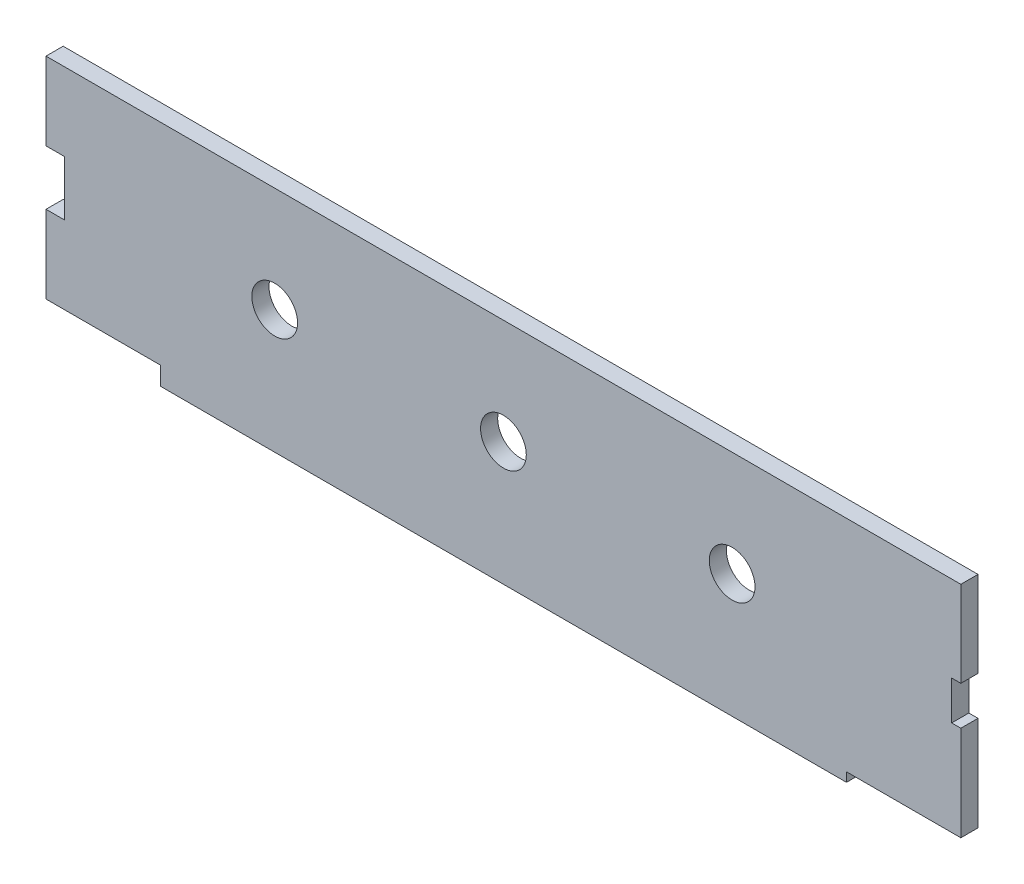
ISO-10303-21;
HEADER;
FILE_DESCRIPTION(('STEP AP214'),'2;1');
FILE_NAME('part.step','',(''),(''),'','','');
FILE_SCHEMA(('AUTOMOTIVE_DESIGN { 1 0 10303 214 1 1 1 1 }'));
ENDSEC;
DATA;
#1=APPLICATION_CONTEXT('core data for automotive mechanical design processes');
#2=APPLICATION_PROTOCOL_DEFINITION('international standard','automotive_design',2000,#1);
#3=PRODUCT_CONTEXT('',#1,'mechanical');
#4=PRODUCT('Part','Part','',(#3));
#5=PRODUCT_RELATED_PRODUCT_CATEGORY('part','',(#4));
#6=PRODUCT_DEFINITION_FORMATION('','',#4);
#7=PRODUCT_DEFINITION_CONTEXT('part definition',#1,'design');
#8=PRODUCT_DEFINITION('design','',#6,#7);
#9=PRODUCT_DEFINITION_SHAPE('','',#8);
#10=(LENGTH_UNIT() NAMED_UNIT(*) SI_UNIT(.MILLI.,.METRE.));
#11=(NAMED_UNIT(*) PLANE_ANGLE_UNIT() SI_UNIT($,.RADIAN.));
#12=(NAMED_UNIT(*) SI_UNIT($,.STERADIAN.) SOLID_ANGLE_UNIT());
#13=UNCERTAINTY_MEASURE_WITH_UNIT(LENGTH_MEASURE(1.E-05),#10,'distance_accuracy_value','');
#14=(GEOMETRIC_REPRESENTATION_CONTEXT(3) GLOBAL_UNCERTAINTY_ASSIGNED_CONTEXT((#13)) GLOBAL_UNIT_ASSIGNED_CONTEXT((#10,
#11,#12)) REPRESENTATION_CONTEXT('',''));
#15=CARTESIAN_POINT('',(0.,0.,0.));
#16=DIRECTION('',(0.,0.,1.));
#17=DIRECTION('',(1.,0.,0.));
#18=AXIS2_PLACEMENT_3D('',#15,#16,#17);
#19=CARTESIAN_POINT('',(0.,0.,1.5));
#20=DIRECTION('',(0.,0.,-1.));
#21=DIRECTION('',(-1.,0.,0.));
#22=AXIS2_PLACEMENT_3D('',#19,#20,#21);
#23=PLANE('',#22);
#24=DIRECTION('',(0.,-1.,0.));
#25=VECTOR('',#24,1.);
#26=CARTESIAN_POINT('',(-40.,2.4,1.5));
#27=LINE('',#26,#25);
#28=CARTESIAN_POINT('',(-40.,9.19999999999997,1.5));
#29=VERTEX_POINT('',#28);
#30=CARTESIAN_POINT('',(-40.,2.4,1.5));
#31=VERTEX_POINT('',#30);
#32=EDGE_CURVE('E209',#29,#31,#27,.T.);
#33=ORIENTED_EDGE('',*,*,#32,.T.);
#34=DIRECTION('',(1.,0.,0.));
#35=VECTOR('',#34,1.);
#36=CARTESIAN_POINT('',(-38.4,2.4,1.5));
#37=LINE('',#36,#35);
#38=CARTESIAN_POINT('',(-38.4,2.4,1.5));
#39=VERTEX_POINT('',#38);
#40=EDGE_CURVE('E117',#31,#39,#37,.T.);
#41=ORIENTED_EDGE('',*,*,#40,.T.);
#42=DIRECTION('',(0.,-1.,0.));
#43=VECTOR('',#42,1.);
#44=CARTESIAN_POINT('',(-38.4,-2.4,1.5));
#45=LINE('',#44,#43);
#46=CARTESIAN_POINT('',(-38.4,-2.4,1.5));
#47=VERTEX_POINT('',#46);
#48=EDGE_CURVE('E248',#39,#47,#45,.T.);
#49=ORIENTED_EDGE('',*,*,#48,.T.);
#50=DIRECTION('',(-1.,0.,0.));
#51=VECTOR('',#50,1.);
#52=CARTESIAN_POINT('',(-40.,-2.4,1.5));
#53=LINE('',#52,#51);
#54=CARTESIAN_POINT('',(-40.,-2.4,1.5));
#55=VERTEX_POINT('',#54);
#56=EDGE_CURVE('E267',#47,#55,#53,.T.);
#57=ORIENTED_EDGE('',*,*,#56,.T.);
#58=DIRECTION('',(0.,-1.,0.));
#59=VECTOR('',#58,1.);
#60=CARTESIAN_POINT('',(-40.,-9.20000000000003,1.5));
#61=LINE('',#60,#59);
#62=CARTESIAN_POINT('',(-40.,-9.20000000000003,1.5));
#63=VERTEX_POINT('',#62);
#64=EDGE_CURVE('E264',#55,#63,#61,.T.);
#65=ORIENTED_EDGE('',*,*,#64,.T.);
#66=DIRECTION('',(1.,0.,0.));
#67=VECTOR('',#66,1.);
#68=CARTESIAN_POINT('',(-30.,-9.2,1.5));
#69=LINE('',#68,#67);
#70=CARTESIAN_POINT('',(-30.,-9.2,1.5));
#71=VERTEX_POINT('',#70);
#72=EDGE_CURVE('E266',#63,#71,#69,.T.);
#73=ORIENTED_EDGE('',*,*,#72,.T.);
#74=DIRECTION('',(0.,-1.,0.));
#75=VECTOR('',#74,1.);
#76=CARTESIAN_POINT('',(-30.,-10.8,1.5));
#77=LINE('',#76,#75);
#78=CARTESIAN_POINT('',(-30.,-10.8,1.5));
#79=VERTEX_POINT('',#78);
#80=EDGE_CURVE('E269',#71,#79,#77,.T.);
#81=ORIENTED_EDGE('',*,*,#80,.T.);
#82=DIRECTION('',(1.,0.,0.));
#83=VECTOR('',#82,1.);
#84=CARTESIAN_POINT('',(30.,-10.7999999999999,1.5));
#85=LINE('',#84,#83);
#86=CARTESIAN_POINT('',(30.,-10.7999999999999,1.5));
#87=VERTEX_POINT('',#86);
#88=EDGE_CURVE('E275',#79,#87,#85,.T.);
#89=ORIENTED_EDGE('',*,*,#88,.T.);
#90=DIRECTION('',(0.,1.,0.));
#91=VECTOR('',#90,1.);
#92=CARTESIAN_POINT('',(30.,-9.99999999999986,1.5));
#93=LINE('',#92,#91);
#94=CARTESIAN_POINT('',(30.,-9.99999999999986,1.5));
#95=VERTEX_POINT('',#94);
#96=EDGE_CURVE('E277',#87,#95,#93,.T.);
#97=ORIENTED_EDGE('',*,*,#96,.T.);
#98=DIRECTION('',(1.,0.,0.));
#99=VECTOR('',#98,1.);
#100=CARTESIAN_POINT('',(40.,-9.99999999999984,1.5));
#101=LINE('',#100,#99);
#102=CARTESIAN_POINT('',(40.,-9.99999999999984,1.5));
#103=VERTEX_POINT('',#102);
#104=EDGE_CURVE('E279',#95,#103,#101,.T.);
#105=ORIENTED_EDGE('',*,*,#104,.T.);
#106=DIRECTION('',(0.,1.,0.));
#107=VECTOR('',#106,1.);
#108=CARTESIAN_POINT('',(40.,-1.7,1.5));
#109=LINE('',#108,#107);
#110=CARTESIAN_POINT('',(40.,-1.7,1.5));
#111=VERTEX_POINT('',#110);
#112=EDGE_CURVE('E281',#103,#111,#109,.T.);
#113=ORIENTED_EDGE('',*,*,#112,.T.);
#114=DIRECTION('',(-1.,0.,0.));
#115=VECTOR('',#114,1.);
#116=CARTESIAN_POINT('',(39.2,-1.7,1.5));
#117=LINE('',#116,#115);
#118=CARTESIAN_POINT('',(39.2,-1.7,1.5));
#119=VERTEX_POINT('',#118);
#120=EDGE_CURVE('E283',#111,#119,#117,.T.);
#121=ORIENTED_EDGE('',*,*,#120,.T.);
#122=DIRECTION('',(0.,1.,0.));
#123=VECTOR('',#122,1.);
#124=CARTESIAN_POINT('',(39.2,1.7,1.5));
#125=LINE('',#124,#123);
#126=CARTESIAN_POINT('',(39.2,1.7,1.5));
#127=VERTEX_POINT('',#126);
#128=EDGE_CURVE('E160',#119,#127,#125,.T.);
#129=ORIENTED_EDGE('',*,*,#128,.T.);
#130=DIRECTION('',(1.,0.,0.));
#131=VECTOR('',#130,1.);
#132=CARTESIAN_POINT('',(40.,1.7,1.5));
#133=LINE('',#132,#131);
#134=CARTESIAN_POINT('',(40.,1.7,1.5));
#135=VERTEX_POINT('',#134);
#136=EDGE_CURVE('E154',#127,#135,#133,.T.);
#137=ORIENTED_EDGE('',*,*,#136,.T.);
#138=DIRECTION('',(0.,1.,0.));
#139=VECTOR('',#138,1.);
#140=CARTESIAN_POINT('',(40.,9.19999999999999,1.5));
#141=LINE('',#140,#139);
#142=CARTESIAN_POINT('',(40.,9.19999999999999,1.5));
#143=VERTEX_POINT('',#142);
#144=EDGE_CURVE('E158',#135,#143,#141,.T.);
#145=ORIENTED_EDGE('',*,*,#144,.T.);
#146=DIRECTION('',(-1.,0.,0.));
#147=VECTOR('',#146,1.);
#148=CARTESIAN_POINT('',(-40.,9.19999999999997,1.5));
#149=LINE('',#148,#147);
#150=EDGE_CURVE('E50',#143,#29,#149,.T.);
#151=ORIENTED_EDGE('',*,*,#150,.T.);
#152=EDGE_LOOP('',(#33,#41,#49,#57,#65,#73,#81,#89,#97,#105,#113,#121,#129,#137,#145,#151));
#153=FACE_BOUND('',#152,.T.);
#154=CARTESIAN_POINT('',(20.,0.,1.5));
#155=DIRECTION('',(0.,0.,1.));
#156=DIRECTION('',(1.,0.,0.));
#157=AXIS2_PLACEMENT_3D('',#154,#155,#156);
#158=CIRCLE('',#157,2.00000000000002);
#159=CARTESIAN_POINT('',(22.,0.,1.5));
#160=VERTEX_POINT('',#159);
#161=EDGE_CURVE('E182',#160,#160,#158,.T.);
#162=ORIENTED_EDGE('',*,*,#161,.F.);
#163=EDGE_LOOP('',(#162));
#164=FACE_BOUND('',#163,.T.);
#165=CARTESIAN_POINT('',(0.,0.,1.5));
#166=DIRECTION('',(0.,0.,1.));
#167=DIRECTION('',(1.,0.,0.));
#168=AXIS2_PLACEMENT_3D('',#165,#166,#167);
#169=CIRCLE('',#168,2.00000000000002);
#170=CARTESIAN_POINT('',(2.,0.,1.5));
#171=VERTEX_POINT('',#170);
#172=EDGE_CURVE('E337',#171,#171,#169,.T.);
#173=ORIENTED_EDGE('',*,*,#172,.F.);
#174=EDGE_LOOP('',(#173));
#175=FACE_BOUND('',#174,.T.);
#176=CARTESIAN_POINT('',(-20.,0.,1.5));
#177=DIRECTION('',(0.,0.,1.));
#178=DIRECTION('',(1.,0.,0.));
#179=AXIS2_PLACEMENT_3D('',#176,#177,#178);
#180=CIRCLE('',#179,2.00000000000002);
#181=CARTESIAN_POINT('',(-18.,0.,1.5));
#182=VERTEX_POINT('',#181);
#183=EDGE_CURVE('E328',#182,#182,#180,.T.);
#184=ORIENTED_EDGE('',*,*,#183,.F.);
#185=EDGE_LOOP('',(#184));
#186=FACE_BOUND('',#185,.T.);
#187=ADVANCED_FACE('F33',(#153,#164,#175,#186),#23,.F.);
#188=CARTESIAN_POINT('',(0.,0.,0.));
#189=DIRECTION('',(0.,0.,-1.));
#190=DIRECTION('',(-1.,0.,0.));
#191=AXIS2_PLACEMENT_3D('',#188,#189,#190);
#192=PLANE('',#191);
#193=CARTESIAN_POINT('',(0.,0.,0.));
#194=DIRECTION('',(0.,0.,1.));
#195=DIRECTION('',(1.,0.,0.));
#196=AXIS2_PLACEMENT_3D('',#193,#194,#195);
#197=CIRCLE('',#196,2.00000000000002);
#198=CARTESIAN_POINT('',(2.,0.,0.));
#199=VERTEX_POINT('',#198);
#200=EDGE_CURVE('E334',#199,#199,#197,.T.);
#201=ORIENTED_EDGE('',*,*,#200,.T.);
#202=EDGE_LOOP('',(#201));
#203=FACE_BOUND('',#202,.T.);
#204=DIRECTION('',(0.,-1.,0.));
#205=VECTOR('',#204,1.);
#206=CARTESIAN_POINT('',(-40.,2.4,0.));
#207=LINE('',#206,#205);
#208=CARTESIAN_POINT('',(-40.,9.19999999999997,0.));
#209=VERTEX_POINT('',#208);
#210=CARTESIAN_POINT('',(-40.,2.4,0.));
#211=VERTEX_POINT('',#210);
#212=EDGE_CURVE('E178',#209,#211,#207,.T.);
#213=ORIENTED_EDGE('',*,*,#212,.F.);
#214=DIRECTION('',(-1.,0.,0.));
#215=VECTOR('',#214,1.);
#216=CARTESIAN_POINT('',(-40.,9.19999999999997,0.));
#217=LINE('',#216,#215);
#218=CARTESIAN_POINT('',(40.,9.19999999999999,0.));
#219=VERTEX_POINT('',#218);
#220=EDGE_CURVE('E109',#219,#209,#217,.T.);
#221=ORIENTED_EDGE('',*,*,#220,.F.);
#222=DIRECTION('',(0.,1.,0.));
#223=VECTOR('',#222,1.);
#224=CARTESIAN_POINT('',(40.,9.19999999999999,0.));
#225=LINE('',#224,#223);
#226=CARTESIAN_POINT('',(40.,1.7,0.));
#227=VERTEX_POINT('',#226);
#228=EDGE_CURVE('E103',#227,#219,#225,.T.);
#229=ORIENTED_EDGE('',*,*,#228,.F.);
#230=DIRECTION('',(1.,0.,0.));
#231=VECTOR('',#230,1.);
#232=CARTESIAN_POINT('',(40.,1.7,0.));
#233=LINE('',#232,#231);
#234=CARTESIAN_POINT('',(39.2,1.7,0.));
#235=VERTEX_POINT('',#234);
#236=EDGE_CURVE('E168',#235,#227,#233,.T.);
#237=ORIENTED_EDGE('',*,*,#236,.F.);
#238=DIRECTION('',(0.,1.,0.));
#239=VECTOR('',#238,1.);
#240=CARTESIAN_POINT('',(39.2,1.7,0.));
#241=LINE('',#240,#239);
#242=CARTESIAN_POINT('',(39.2,-1.7,0.));
#243=VERTEX_POINT('',#242);
#244=EDGE_CURVE('E204',#243,#235,#241,.T.);
#245=ORIENTED_EDGE('',*,*,#244,.F.);
#246=DIRECTION('',(-1.,0.,0.));
#247=VECTOR('',#246,1.);
#248=CARTESIAN_POINT('',(39.2,-1.7,0.));
#249=LINE('',#248,#247);
#250=CARTESIAN_POINT('',(40.,-1.7,0.));
#251=VERTEX_POINT('',#250);
#252=EDGE_CURVE('E202',#251,#243,#249,.T.);
#253=ORIENTED_EDGE('',*,*,#252,.F.);
#254=DIRECTION('',(0.,1.,0.));
#255=VECTOR('',#254,1.);
#256=CARTESIAN_POINT('',(40.,-1.7,0.));
#257=LINE('',#256,#255);
#258=CARTESIAN_POINT('',(40.,-9.99999999999984,0.));
#259=VERTEX_POINT('',#258);
#260=EDGE_CURVE('E200',#259,#251,#257,.T.);
#261=ORIENTED_EDGE('',*,*,#260,.F.);
#262=DIRECTION('',(1.,0.,0.));
#263=VECTOR('',#262,1.);
#264=CARTESIAN_POINT('',(40.,-9.99999999999984,0.));
#265=LINE('',#264,#263);
#266=CARTESIAN_POINT('',(30.,-9.99999999999986,0.));
#267=VERTEX_POINT('',#266);
#268=EDGE_CURVE('E198',#267,#259,#265,.T.);
#269=ORIENTED_EDGE('',*,*,#268,.F.);
#270=DIRECTION('',(0.,1.,0.));
#271=VECTOR('',#270,1.);
#272=CARTESIAN_POINT('',(30.,-9.99999999999986,0.));
#273=LINE('',#272,#271);
#274=CARTESIAN_POINT('',(30.,-10.7999999999999,0.));
#275=VERTEX_POINT('',#274);
#276=EDGE_CURVE('E196',#275,#267,#273,.T.);
#277=ORIENTED_EDGE('',*,*,#276,.F.);
#278=DIRECTION('',(1.,0.,0.));
#279=VECTOR('',#278,1.);
#280=CARTESIAN_POINT('',(30.,-10.7999999999999,0.));
#281=LINE('',#280,#279);
#282=CARTESIAN_POINT('',(-30.,-10.8,0.));
#283=VERTEX_POINT('',#282);
#284=EDGE_CURVE('E194',#283,#275,#281,.T.);
#285=ORIENTED_EDGE('',*,*,#284,.F.);
#286=DIRECTION('',(0.,-1.,0.));
#287=VECTOR('',#286,1.);
#288=CARTESIAN_POINT('',(-30.,-10.8,0.));
#289=LINE('',#288,#287);
#290=CARTESIAN_POINT('',(-30.,-9.2,0.));
#291=VERTEX_POINT('',#290);
#292=EDGE_CURVE('E192',#291,#283,#289,.T.);
#293=ORIENTED_EDGE('',*,*,#292,.F.);
#294=DIRECTION('',(1.,0.,0.));
#295=VECTOR('',#294,1.);
#296=CARTESIAN_POINT('',(-30.,-9.2,0.));
#297=LINE('',#296,#295);
#298=CARTESIAN_POINT('',(-40.,-9.20000000000003,0.));
#299=VERTEX_POINT('',#298);
#300=EDGE_CURVE('E190',#299,#291,#297,.T.);
#301=ORIENTED_EDGE('',*,*,#300,.F.);
#302=DIRECTION('',(0.,-1.,0.));
#303=VECTOR('',#302,1.);
#304=CARTESIAN_POINT('',(-40.,-9.20000000000003,0.));
#305=LINE('',#304,#303);
#306=CARTESIAN_POINT('',(-40.,-2.4,0.));
#307=VERTEX_POINT('',#306);
#308=EDGE_CURVE('E188',#307,#299,#305,.T.);
#309=ORIENTED_EDGE('',*,*,#308,.F.);
#310=DIRECTION('',(-1.,0.,0.));
#311=VECTOR('',#310,1.);
#312=CARTESIAN_POINT('',(-40.,-2.4,0.));
#313=LINE('',#312,#311);
#314=CARTESIAN_POINT('',(-38.4,-2.4,0.));
#315=VERTEX_POINT('',#314);
#316=EDGE_CURVE('E186',#315,#307,#313,.T.);
#317=ORIENTED_EDGE('',*,*,#316,.F.);
#318=DIRECTION('',(0.,-1.,0.));
#319=VECTOR('',#318,1.);
#320=CARTESIAN_POINT('',(-38.4,-2.4,0.));
#321=LINE('',#320,#319);
#322=CARTESIAN_POINT('',(-38.4,2.4,0.));
#323=VERTEX_POINT('',#322);
#324=EDGE_CURVE('E184',#323,#315,#321,.T.);
#325=ORIENTED_EDGE('',*,*,#324,.F.);
#326=DIRECTION('',(1.,0.,0.));
#327=VECTOR('',#326,1.);
#328=CARTESIAN_POINT('',(-38.4,2.4,0.));
#329=LINE('',#328,#327);
#330=EDGE_CURVE('E181',#211,#323,#329,.T.);
#331=ORIENTED_EDGE('',*,*,#330,.F.);
#332=EDGE_LOOP('',(#213,#221,#229,#237,#245,#253,#261,#269,#277,#285,#293,#301,#309,#317,#325,#331));
#333=FACE_BOUND('',#332,.T.);
#334=CARTESIAN_POINT('',(20.,0.,0.));
#335=DIRECTION('',(0.,0.,1.));
#336=DIRECTION('',(1.,0.,0.));
#337=AXIS2_PLACEMENT_3D('',#334,#335,#336);
#338=CIRCLE('',#337,2.00000000000002);
#339=CARTESIAN_POINT('',(22.,0.,0.));
#340=VERTEX_POINT('',#339);
#341=EDGE_CURVE('E340',#340,#340,#338,.T.);
#342=ORIENTED_EDGE('',*,*,#341,.T.);
#343=EDGE_LOOP('',(#342));
#344=FACE_BOUND('',#343,.T.);
#345=CARTESIAN_POINT('',(-20.,0.,0.));
#346=DIRECTION('',(0.,0.,1.));
#347=DIRECTION('',(1.,0.,0.));
#348=AXIS2_PLACEMENT_3D('',#345,#346,#347);
#349=CIRCLE('',#348,2.00000000000002);
#350=CARTESIAN_POINT('',(-18.,0.,0.));
#351=VERTEX_POINT('',#350);
#352=EDGE_CURVE('E331',#351,#351,#349,.T.);
#353=ORIENTED_EDGE('',*,*,#352,.T.);
#354=EDGE_LOOP('',(#353));
#355=FACE_BOUND('',#354,.T.);
#356=ADVANCED_FACE('F252',(#203,#333,#344,#355),#192,.T.);
#357=CARTESIAN_POINT('',(-40.,2.4,1.5));
#358=DIRECTION('',(1.,0.,0.));
#359=DIRECTION('',(0.,1.,0.));
#360=AXIS2_PLACEMENT_3D('',#357,#358,#359);
#361=PLANE('',#360);
#362=ORIENTED_EDGE('',*,*,#212,.T.);
#363=DIRECTION('',(0.,0.,-1.));
#364=VECTOR('',#363,1.);
#365=CARTESIAN_POINT('',(-40.,2.4,1.5));
#366=LINE('',#365,#364);
#367=EDGE_CURVE('E11',#31,#211,#366,.T.);
#368=ORIENTED_EDGE('',*,*,#367,.F.);
#369=ORIENTED_EDGE('',*,*,#32,.F.);
#370=DIRECTION('',(0.,0.,-1.));
#371=VECTOR('',#370,1.);
#372=CARTESIAN_POINT('',(-40.,9.19999999999997,1.5));
#373=LINE('',#372,#371);
#374=EDGE_CURVE('E174',#29,#209,#373,.T.);
#375=ORIENTED_EDGE('',*,*,#374,.T.);
#376=EDGE_LOOP('',(#362,#368,#369,#375));
#377=FACE_BOUND('',#376,.T.);
#378=ADVANCED_FACE('F35',(#377),#361,.F.);
#379=CARTESIAN_POINT('',(-38.4,2.4,1.5));
#380=DIRECTION('',(0.,1.,0.));
#381=DIRECTION('',(0.,0.,1.));
#382=AXIS2_PLACEMENT_3D('',#379,#380,#381);
#383=PLANE('',#382);
#384=ORIENTED_EDGE('',*,*,#330,.T.);
#385=DIRECTION('',(0.,0.,-1.));
#386=VECTOR('',#385,1.);
#387=CARTESIAN_POINT('',(-38.4,2.4,1.5));
#388=LINE('',#387,#386);
#389=EDGE_CURVE('E42',#39,#323,#388,.T.);
#390=ORIENTED_EDGE('',*,*,#389,.F.);
#391=ORIENTED_EDGE('',*,*,#40,.F.);
#392=ORIENTED_EDGE('',*,*,#367,.T.);
#393=EDGE_LOOP('',(#384,#390,#391,#392));
#394=FACE_BOUND('',#393,.T.);
#395=ADVANCED_FACE('F483',(#394),#383,.F.);
#396=CARTESIAN_POINT('',(-38.4,-2.4,1.5));
#397=DIRECTION('',(1.,0.,0.));
#398=DIRECTION('',(0.,0.,-1.));
#399=AXIS2_PLACEMENT_3D('',#396,#397,#398);
#400=PLANE('',#399);
#401=ORIENTED_EDGE('',*,*,#324,.T.);
#402=DIRECTION('',(0.,0.,-1.));
#403=VECTOR('',#402,1.);
#404=CARTESIAN_POINT('',(-38.4,-2.4,1.5));
#405=LINE('',#404,#403);
#406=EDGE_CURVE('E240',#47,#315,#405,.T.);
#407=ORIENTED_EDGE('',*,*,#406,.F.);
#408=ORIENTED_EDGE('',*,*,#48,.F.);
#409=ORIENTED_EDGE('',*,*,#389,.T.);
#410=EDGE_LOOP('',(#401,#407,#408,#409));
#411=FACE_BOUND('',#410,.T.);
#412=ADVANCED_FACE('F246',(#411),#400,.F.);
#413=CARTESIAN_POINT('',(-40.,-2.4,1.5));
#414=DIRECTION('',(0.,-1.,0.));
#415=DIRECTION('',(0.,0.,-1.));
#416=AXIS2_PLACEMENT_3D('',#413,#414,#415);
#417=PLANE('',#416);
#418=ORIENTED_EDGE('',*,*,#316,.T.);
#419=DIRECTION('',(0.,0.,-1.));
#420=VECTOR('',#419,1.);
#421=CARTESIAN_POINT('',(-40.,-2.4,1.5));
#422=LINE('',#421,#420);
#423=EDGE_CURVE('E237',#55,#307,#422,.T.);
#424=ORIENTED_EDGE('',*,*,#423,.F.);
#425=ORIENTED_EDGE('',*,*,#56,.F.);
#426=ORIENTED_EDGE('',*,*,#406,.T.);
#427=EDGE_LOOP('',(#418,#424,#425,#426));
#428=FACE_BOUND('',#427,.T.);
#429=ADVANCED_FACE('F258',(#428),#417,.F.);
#430=CARTESIAN_POINT('',(-40.,-9.20000000000003,1.5));
#431=DIRECTION('',(1.,0.,0.));
#432=DIRECTION('',(0.,1.,0.));
#433=AXIS2_PLACEMENT_3D('',#430,#431,#432);
#434=PLANE('',#433);
#435=ORIENTED_EDGE('',*,*,#308,.T.);
#436=DIRECTION('',(0.,0.,-1.));
#437=VECTOR('',#436,1.);
#438=CARTESIAN_POINT('',(-40.,-9.20000000000003,1.5));
#439=LINE('',#438,#437);
#440=EDGE_CURVE('E234',#63,#299,#439,.T.);
#441=ORIENTED_EDGE('',*,*,#440,.F.);
#442=ORIENTED_EDGE('',*,*,#64,.F.);
#443=ORIENTED_EDGE('',*,*,#423,.T.);
#444=EDGE_LOOP('',(#435,#441,#442,#443));
#445=FACE_BOUND('',#444,.T.);
#446=ADVANCED_FACE('F262',(#445),#434,.F.);
#447=CARTESIAN_POINT('',(-30.,-9.2,1.5));
#448=DIRECTION('',(0.,1.,0.));
#449=DIRECTION('',(-1.,0.,0.));
#450=AXIS2_PLACEMENT_3D('',#447,#448,#449);
#451=PLANE('',#450);
#452=ORIENTED_EDGE('',*,*,#300,.T.);
#453=DIRECTION('',(0.,0.,-1.));
#454=VECTOR('',#453,1.);
#455=CARTESIAN_POINT('',(-30.,-9.2,1.5));
#456=LINE('',#455,#454);
#457=EDGE_CURVE('E231',#71,#291,#456,.T.);
#458=ORIENTED_EDGE('',*,*,#457,.F.);
#459=ORIENTED_EDGE('',*,*,#72,.F.);
#460=ORIENTED_EDGE('',*,*,#440,.T.);
#461=EDGE_LOOP('',(#452,#458,#459,#460));
#462=FACE_BOUND('',#461,.T.);
#463=ADVANCED_FACE('F448',(#462),#451,.F.);
#464=CARTESIAN_POINT('',(-30.,-10.8,1.5));
#465=DIRECTION('',(1.,0.,0.));
#466=DIRECTION('',(0.,1.,0.));
#467=AXIS2_PLACEMENT_3D('',#464,#465,#466);
#468=PLANE('',#467);
#469=ORIENTED_EDGE('',*,*,#292,.T.);
#470=DIRECTION('',(0.,0.,-1.));
#471=VECTOR('',#470,1.);
#472=CARTESIAN_POINT('',(-30.,-10.8,1.5));
#473=LINE('',#472,#471);
#474=EDGE_CURVE('E228',#79,#283,#473,.T.);
#475=ORIENTED_EDGE('',*,*,#474,.F.);
#476=ORIENTED_EDGE('',*,*,#80,.F.);
#477=ORIENTED_EDGE('',*,*,#457,.T.);
#478=EDGE_LOOP('',(#469,#475,#476,#477));
#479=FACE_BOUND('',#478,.T.);
#480=ADVANCED_FACE('F438',(#479),#468,.F.);
#481=CARTESIAN_POINT('',(30.,-10.7999999999999,1.5));
#482=DIRECTION('',(0.,1.,0.));
#483=DIRECTION('',(-1.,0.,0.));
#484=AXIS2_PLACEMENT_3D('',#481,#482,#483);
#485=PLANE('',#484);
#486=ORIENTED_EDGE('',*,*,#284,.T.);
#487=DIRECTION('',(0.,0.,-1.));
#488=VECTOR('',#487,1.);
#489=CARTESIAN_POINT('',(30.,-10.7999999999999,1.5));
#490=LINE('',#489,#488);
#491=EDGE_CURVE('E225',#87,#275,#490,.T.);
#492=ORIENTED_EDGE('',*,*,#491,.F.);
#493=ORIENTED_EDGE('',*,*,#88,.F.);
#494=ORIENTED_EDGE('',*,*,#474,.T.);
#495=EDGE_LOOP('',(#486,#492,#493,#494));
#496=FACE_BOUND('',#495,.T.);
#497=ADVANCED_FACE('F428',(#496),#485,.F.);
#498=CARTESIAN_POINT('',(30.,-9.99999999999986,1.5));
#499=DIRECTION('',(-1.,0.,0.));
#500=DIRECTION('',(0.,-1.,0.));
#501=AXIS2_PLACEMENT_3D('',#498,#499,#500);
#502=PLANE('',#501);
#503=ORIENTED_EDGE('',*,*,#276,.T.);
#504=DIRECTION('',(0.,0.,-1.));
#505=VECTOR('',#504,1.);
#506=CARTESIAN_POINT('',(30.,-9.99999999999986,1.5));
#507=LINE('',#506,#505);
#508=EDGE_CURVE('E222',#95,#267,#507,.T.);
#509=ORIENTED_EDGE('',*,*,#508,.F.);
#510=ORIENTED_EDGE('',*,*,#96,.F.);
#511=ORIENTED_EDGE('',*,*,#491,.T.);
#512=EDGE_LOOP('',(#503,#509,#510,#511));
#513=FACE_BOUND('',#512,.T.);
#514=ADVANCED_FACE('F418',(#513),#502,.F.);
#515=CARTESIAN_POINT('',(40.,-9.99999999999984,1.5));
#516=DIRECTION('',(0.,1.,0.));
#517=DIRECTION('',(-1.,0.,0.));
#518=AXIS2_PLACEMENT_3D('',#515,#516,#517);
#519=PLANE('',#518);
#520=ORIENTED_EDGE('',*,*,#268,.T.);
#521=DIRECTION('',(0.,0.,-1.));
#522=VECTOR('',#521,1.);
#523=CARTESIAN_POINT('',(40.,-9.99999999999984,1.5));
#524=LINE('',#523,#522);
#525=EDGE_CURVE('E219',#103,#259,#524,.T.);
#526=ORIENTED_EDGE('',*,*,#525,.F.);
#527=ORIENTED_EDGE('',*,*,#104,.F.);
#528=ORIENTED_EDGE('',*,*,#508,.T.);
#529=EDGE_LOOP('',(#520,#526,#527,#528));
#530=FACE_BOUND('',#529,.T.);
#531=ADVANCED_FACE('F408',(#530),#519,.F.);
#532=CARTESIAN_POINT('',(40.,-1.7,1.5));
#533=DIRECTION('',(-1.,0.,0.));
#534=DIRECTION('',(0.,-1.,0.));
#535=AXIS2_PLACEMENT_3D('',#532,#533,#534);
#536=PLANE('',#535);
#537=ORIENTED_EDGE('',*,*,#260,.T.);
#538=DIRECTION('',(0.,0.,-1.));
#539=VECTOR('',#538,1.);
#540=CARTESIAN_POINT('',(40.,-1.7,1.5));
#541=LINE('',#540,#539);
#542=EDGE_CURVE('E216',#111,#251,#541,.T.);
#543=ORIENTED_EDGE('',*,*,#542,.F.);
#544=ORIENTED_EDGE('',*,*,#112,.F.);
#545=ORIENTED_EDGE('',*,*,#525,.T.);
#546=EDGE_LOOP('',(#537,#543,#544,#545));
#547=FACE_BOUND('',#546,.T.);
#548=ADVANCED_FACE('F399',(#547),#536,.F.);
#549=CARTESIAN_POINT('',(39.2,-1.7,1.5));
#550=DIRECTION('',(0.,-1.,0.));
#551=DIRECTION('',(1.,0.,0.));
#552=AXIS2_PLACEMENT_3D('',#549,#550,#551);
#553=PLANE('',#552);
#554=ORIENTED_EDGE('',*,*,#252,.T.);
#555=DIRECTION('',(0.,0.,-1.));
#556=VECTOR('',#555,1.);
#557=CARTESIAN_POINT('',(39.2,-1.7,1.5));
#558=LINE('',#557,#556);
#559=EDGE_CURVE('E213',#119,#243,#558,.T.);
#560=ORIENTED_EDGE('',*,*,#559,.F.);
#561=ORIENTED_EDGE('',*,*,#120,.F.);
#562=ORIENTED_EDGE('',*,*,#542,.T.);
#563=EDGE_LOOP('',(#554,#560,#561,#562));
#564=FACE_BOUND('',#563,.T.);
#565=ADVANCED_FACE('F289',(#564),#553,.F.);
#566=CARTESIAN_POINT('',(39.2,1.7,1.5));
#567=DIRECTION('',(-1.,0.,0.));
#568=DIRECTION('',(0.,0.,1.));
#569=AXIS2_PLACEMENT_3D('',#566,#567,#568);
#570=PLANE('',#569);
#571=ORIENTED_EDGE('',*,*,#244,.T.);
#572=DIRECTION('',(0.,0.,-1.));
#573=VECTOR('',#572,1.);
#574=CARTESIAN_POINT('',(39.2,1.7,1.5));
#575=LINE('',#574,#573);
#576=EDGE_CURVE('E169',#127,#235,#575,.T.);
#577=ORIENTED_EDGE('',*,*,#576,.F.);
#578=ORIENTED_EDGE('',*,*,#128,.F.);
#579=ORIENTED_EDGE('',*,*,#559,.T.);
#580=EDGE_LOOP('',(#571,#577,#578,#579));
#581=FACE_BOUND('',#580,.T.);
#582=ADVANCED_FACE('F293',(#581),#570,.F.);
#583=CARTESIAN_POINT('',(40.,1.7,1.5));
#584=DIRECTION('',(0.,1.,0.));
#585=DIRECTION('',(-1.,0.,0.));
#586=AXIS2_PLACEMENT_3D('',#583,#584,#585);
#587=PLANE('',#586);
#588=ORIENTED_EDGE('',*,*,#236,.T.);
#589=DIRECTION('',(0.,0.,-1.));
#590=VECTOR('',#589,1.);
#591=CARTESIAN_POINT('',(40.,1.7,1.5));
#592=LINE('',#591,#590);
#593=EDGE_CURVE('E165',#135,#227,#592,.T.);
#594=ORIENTED_EDGE('',*,*,#593,.F.);
#595=ORIENTED_EDGE('',*,*,#136,.F.);
#596=ORIENTED_EDGE('',*,*,#576,.T.);
#597=EDGE_LOOP('',(#588,#594,#595,#596));
#598=FACE_BOUND('',#597,.T.);
#599=ADVANCED_FACE('F166',(#598),#587,.F.);
#600=CARTESIAN_POINT('',(40.,9.19999999999999,1.5));
#601=DIRECTION('',(-1.,0.,0.));
#602=DIRECTION('',(0.,0.,1.));
#603=AXIS2_PLACEMENT_3D('',#600,#601,#602);
#604=PLANE('',#603);
#605=ORIENTED_EDGE('',*,*,#228,.T.);
#606=DIRECTION('',(0.,0.,-1.));
#607=VECTOR('',#606,1.);
#608=CARTESIAN_POINT('',(40.,9.19999999999999,1.5));
#609=LINE('',#608,#607);
#610=EDGE_CURVE('E170',#143,#219,#609,.T.);
#611=ORIENTED_EDGE('',*,*,#610,.F.);
#612=ORIENTED_EDGE('',*,*,#144,.F.);
#613=ORIENTED_EDGE('',*,*,#593,.T.);
#614=EDGE_LOOP('',(#605,#611,#612,#613));
#615=FACE_BOUND('',#614,.T.);
#616=ADVANCED_FACE('F172',(#615),#604,.F.);
#617=CARTESIAN_POINT('',(-40.,9.19999999999997,1.5));
#618=DIRECTION('',(0.,-1.,0.));
#619=DIRECTION('',(1.,0.,0.));
#620=AXIS2_PLACEMENT_3D('',#617,#618,#619);
#621=PLANE('',#620);
#622=ORIENTED_EDGE('',*,*,#220,.T.);
#623=ORIENTED_EDGE('',*,*,#374,.F.);
#624=ORIENTED_EDGE('',*,*,#150,.F.);
#625=ORIENTED_EDGE('',*,*,#610,.T.);
#626=EDGE_LOOP('',(#622,#623,#624,#625));
#627=FACE_BOUND('',#626,.T.);
#628=ADVANCED_FACE('F297',(#627),#621,.F.);
#629=CARTESIAN_POINT('',(20.,0.,1.5));
#630=DIRECTION('',(0.,0.,-1.));
#631=DIRECTION('',(-1.,0.,0.));
#632=AXIS2_PLACEMENT_3D('',#629,#630,#631);
#633=CYLINDRICAL_SURFACE('',#632,2.00000000000002);
#634=ORIENTED_EDGE('',*,*,#161,.T.);
#635=EDGE_LOOP('',(#634));
#636=FACE_BOUND('',#635,.T.);
#637=ORIENTED_EDGE('',*,*,#341,.F.);
#638=EDGE_LOOP('',(#637));
#639=FACE_BOUND('',#638,.T.);
#640=ADVANCED_FACE('F299',(#636,#639),#633,.F.);
#641=CARTESIAN_POINT('',(0.,0.,1.5));
#642=DIRECTION('',(0.,0.,-1.));
#643=DIRECTION('',(-1.,0.,0.));
#644=AXIS2_PLACEMENT_3D('',#641,#642,#643);
#645=CYLINDRICAL_SURFACE('',#644,2.00000000000002);
#646=ORIENTED_EDGE('',*,*,#172,.T.);
#647=EDGE_LOOP('',(#646));
#648=FACE_BOUND('',#647,.T.);
#649=ORIENTED_EDGE('',*,*,#200,.F.);
#650=EDGE_LOOP('',(#649));
#651=FACE_BOUND('',#650,.T.);
#652=ADVANCED_FACE('F305',(#648,#651),#645,.F.);
#653=CARTESIAN_POINT('',(-20.,0.,1.5));
#654=DIRECTION('',(0.,0.,-1.));
#655=DIRECTION('',(-1.,0.,0.));
#656=AXIS2_PLACEMENT_3D('',#653,#654,#655);
#657=CYLINDRICAL_SURFACE('',#656,2.00000000000002);
#658=ORIENTED_EDGE('',*,*,#183,.T.);
#659=EDGE_LOOP('',(#658));
#660=FACE_BOUND('',#659,.T.);
#661=ORIENTED_EDGE('',*,*,#352,.F.);
#662=EDGE_LOOP('',(#661));
#663=FACE_BOUND('',#662,.T.);
#664=ADVANCED_FACE('F319',(#660,#663),#657,.F.);
#665=CLOSED_SHELL('',(#187,#356,#378,#395,#412,#429,#446,#463,#480,#497,#514,#531,#548,#565,
#582,#599,#616,#628,#640,#652,#664));
#666=MANIFOLD_SOLID_BREP('B2',#665);
#667=ADVANCED_BREP_SHAPE_REPRESENTATION('',(#18,#666),#14);
#668=SHAPE_DEFINITION_REPRESENTATION(#9,#667);
ENDSEC;
END-ISO-10303-21;
